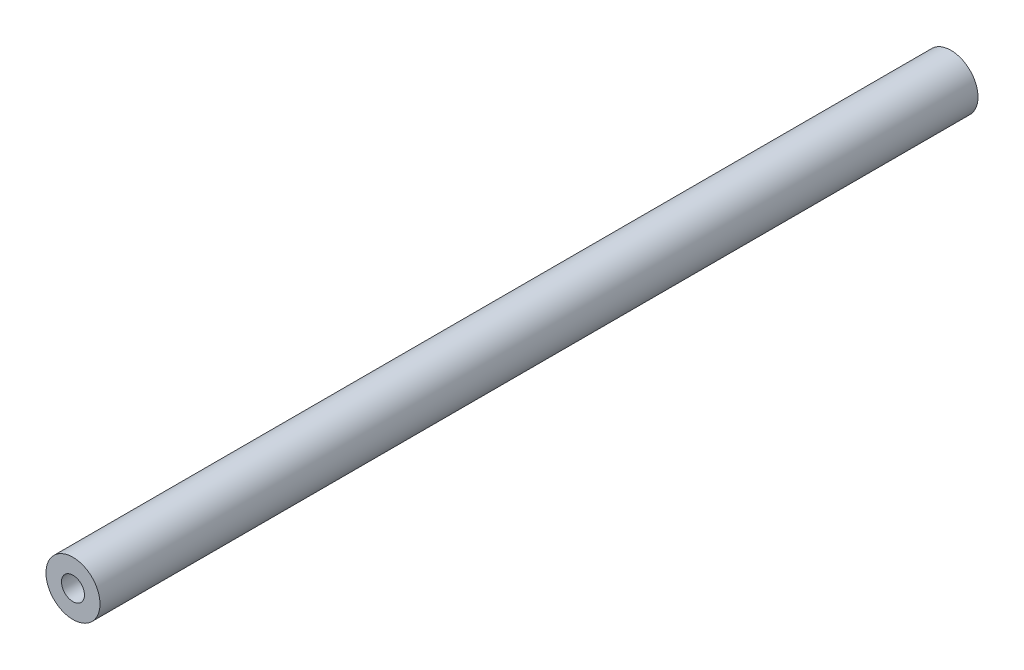
ISO-10303-21;
HEADER;
FILE_DESCRIPTION(('STEP AP214'),'2;1');
FILE_NAME('part.step','',(''),(''),'','','');
FILE_SCHEMA(('AUTOMOTIVE_DESIGN { 1 0 10303 214 1 1 1 1 }'));
ENDSEC;
DATA;
#1=APPLICATION_CONTEXT('core data for automotive mechanical design processes');
#2=APPLICATION_PROTOCOL_DEFINITION('international standard','automotive_design',2000,#1);
#3=PRODUCT_CONTEXT('',#1,'mechanical');
#4=PRODUCT('Part','Part','',(#3));
#5=PRODUCT_RELATED_PRODUCT_CATEGORY('part','',(#4));
#6=PRODUCT_DEFINITION_FORMATION('','',#4);
#7=PRODUCT_DEFINITION_CONTEXT('part definition',#1,'design');
#8=PRODUCT_DEFINITION('design','',#6,#7);
#9=PRODUCT_DEFINITION_SHAPE('','',#8);
#10=(LENGTH_UNIT() NAMED_UNIT(*) SI_UNIT(.MILLI.,.METRE.));
#11=(NAMED_UNIT(*) PLANE_ANGLE_UNIT() SI_UNIT($,.RADIAN.));
#12=(NAMED_UNIT(*) SI_UNIT($,.STERADIAN.) SOLID_ANGLE_UNIT());
#13=UNCERTAINTY_MEASURE_WITH_UNIT(LENGTH_MEASURE(1.E-05),#10,'distance_accuracy_value','');
#14=(GEOMETRIC_REPRESENTATION_CONTEXT(3) GLOBAL_UNCERTAINTY_ASSIGNED_CONTEXT((#13)) GLOBAL_UNIT_ASSIGNED_CONTEXT((#10,
#11,#12)) REPRESENTATION_CONTEXT('',''));
#15=CARTESIAN_POINT('',(0.,0.,0.));
#16=DIRECTION('',(0.,0.,1.));
#17=DIRECTION('',(1.,0.,0.));
#18=AXIS2_PLACEMENT_3D('',#15,#16,#17);
#19=CARTESIAN_POINT('',(0.,0.,260.));
#20=DIRECTION('',(0.,0.,-1.));
#21=DIRECTION('',(-1.,0.,0.));
#22=AXIS2_PLACEMENT_3D('',#19,#20,#21);
#23=CYLINDRICAL_SURFACE('',#22,8.);
#24=CARTESIAN_POINT('',(0.,0.,260.));
#25=DIRECTION('',(0.,0.,1.));
#26=DIRECTION('',(1.,0.,0.));
#27=AXIS2_PLACEMENT_3D('',#24,#25,#26);
#28=CIRCLE('',#27,8.);
#29=CARTESIAN_POINT('',(8.,0.,260.));
#30=VERTEX_POINT('',#29);
#31=EDGE_CURVE('E11',#30,#30,#28,.T.);
#32=ORIENTED_EDGE('',*,*,#31,.F.);
#33=EDGE_LOOP('',(#32));
#34=FACE_BOUND('',#33,.T.);
#35=CARTESIAN_POINT('',(0.,0.,0.));
#36=DIRECTION('',(0.,0.,1.));
#37=DIRECTION('',(1.,0.,0.));
#38=AXIS2_PLACEMENT_3D('',#35,#36,#37);
#39=CIRCLE('',#38,8.);
#40=CARTESIAN_POINT('',(8.,0.,0.));
#41=VERTEX_POINT('',#40);
#42=EDGE_CURVE('E40',#41,#41,#39,.T.);
#43=ORIENTED_EDGE('',*,*,#42,.T.);
#44=EDGE_LOOP('',(#43));
#45=FACE_BOUND('',#44,.T.);
#46=ADVANCED_FACE('F37',(#34,#45),#23,.T.);
#47=CARTESIAN_POINT('',(0.,0.,260.));
#48=DIRECTION('',(0.,0.,1.));
#49=DIRECTION('',(1.,0.,0.));
#50=AXIS2_PLACEMENT_3D('',#47,#48,#49);
#51=PLANE('',#50);
#52=CARTESIAN_POINT('',(0.,0.,260.));
#53=DIRECTION('',(0.,0.,1.));
#54=DIRECTION('',(1.,0.,0.));
#55=AXIS2_PLACEMENT_3D('',#52,#53,#54);
#56=CIRCLE('',#55,3.39999999999999);
#57=CARTESIAN_POINT('',(3.39999999999999,0.,260.));
#58=VERTEX_POINT('',#57);
#59=EDGE_CURVE('E60',#58,#58,#56,.T.);
#60=ORIENTED_EDGE('',*,*,#59,.F.);
#61=EDGE_LOOP('',(#60));
#62=FACE_BOUND('',#61,.T.);
#63=ORIENTED_EDGE('',*,*,#31,.T.);
#64=EDGE_LOOP('',(#63));
#65=FACE_BOUND('',#64,.T.);
#66=ADVANCED_FACE('F79',(#62,#65),#51,.T.);
#67=CARTESIAN_POINT('',(0.,0.,0.));
#68=DIRECTION('',(0.,0.,1.));
#69=DIRECTION('',(1.,0.,0.));
#70=AXIS2_PLACEMENT_3D('',#67,#68,#69);
#71=PLANE('',#70);
#72=CARTESIAN_POINT('',(0.,0.,0.));
#73=DIRECTION('',(0.,0.,-1.));
#74=DIRECTION('',(-1.,0.,0.));
#75=AXIS2_PLACEMENT_3D('',#72,#73,#74);
#76=CIRCLE('',#75,3.39999999999999);
#77=CARTESIAN_POINT('',(-3.39999999999999,0.,0.));
#78=VERTEX_POINT('',#77);
#79=EDGE_CURVE('E61',#78,#78,#76,.T.);
#80=ORIENTED_EDGE('',*,*,#79,.F.);
#81=EDGE_LOOP('',(#80));
#82=FACE_BOUND('',#81,.T.);
#83=ORIENTED_EDGE('',*,*,#42,.F.);
#84=EDGE_LOOP('',(#83));
#85=FACE_BOUND('',#84,.T.);
#86=ADVANCED_FACE('F76',(#82,#85),#71,.F.);
#87=CARTESIAN_POINT('',(0.,0.,233.75));
#88=DIRECTION('',(0.,0.,1.));
#89=DIRECTION('',(1.,0.,0.));
#90=AXIS2_PLACEMENT_3D('',#87,#88,#89);
#91=CONICAL_SURFACE('',#90,3.39999999999999,1.02974425867665);
#92=CARTESIAN_POINT('',(0.,0.,231.707073895306));
#93=VERTEX_POINT('',#92);
#94=VERTEX_LOOP('',#93);
#95=FACE_BOUND('',#94,.T.);
#96=CARTESIAN_POINT('',(0.,0.,233.75));
#97=DIRECTION('',(0.,0.,1.));
#98=DIRECTION('',(1.,0.,0.));
#99=AXIS2_PLACEMENT_3D('',#96,#97,#98);
#100=CIRCLE('',#99,3.39999999999999);
#101=CARTESIAN_POINT('',(3.39999999999999,0.,233.75));
#102=VERTEX_POINT('',#101);
#103=EDGE_CURVE('E64',#102,#102,#100,.T.);
#104=ORIENTED_EDGE('',*,*,#103,.T.);
#105=EDGE_LOOP('',(#104));
#106=FACE_BOUND('',#105,.T.);
#107=ADVANCED_FACE('F78',(#95,#106),#91,.F.);
#108=CARTESIAN_POINT('',(0.,0.,260.));
#109=DIRECTION('',(0.,0.,1.));
#110=DIRECTION('',(1.,0.,0.));
#111=AXIS2_PLACEMENT_3D('',#108,#109,#110);
#112=CYLINDRICAL_SURFACE('',#111,3.39999999999999);
#113=ORIENTED_EDGE('',*,*,#103,.F.);
#114=EDGE_LOOP('',(#113));
#115=FACE_BOUND('',#114,.T.);
#116=ORIENTED_EDGE('',*,*,#59,.T.);
#117=EDGE_LOOP('',(#116));
#118=FACE_BOUND('',#117,.T.);
#119=ADVANCED_FACE('F54',(#115,#118),#112,.F.);
#120=CARTESIAN_POINT('',(0.,0.,26.25));
#121=DIRECTION('',(0.,0.,-1.));
#122=DIRECTION('',(-1.,0.,0.));
#123=AXIS2_PLACEMENT_3D('',#120,#121,#122);
#124=CONICAL_SURFACE('',#123,3.39999999999999,1.02974425867665);
#125=CARTESIAN_POINT('',(0.,0.,28.2929261046937));
#126=VERTEX_POINT('',#125);
#127=VERTEX_LOOP('',#126);
#128=FACE_BOUND('',#127,.T.);
#129=CARTESIAN_POINT('',(0.,0.,26.25));
#130=DIRECTION('',(0.,0.,-1.));
#131=DIRECTION('',(-1.,0.,0.));
#132=AXIS2_PLACEMENT_3D('',#129,#130,#131);
#133=CIRCLE('',#132,3.39999999999999);
#134=CARTESIAN_POINT('',(-3.39999999999999,0.,26.25));
#135=VERTEX_POINT('',#134);
#136=EDGE_CURVE('E58',#135,#135,#133,.T.);
#137=ORIENTED_EDGE('',*,*,#136,.T.);
#138=EDGE_LOOP('',(#137));
#139=FACE_BOUND('',#138,.T.);
#140=ADVANCED_FACE('F50',(#128,#139),#124,.F.);
#141=CARTESIAN_POINT('',(0.,0.,0.));
#142=DIRECTION('',(0.,0.,-1.));
#143=DIRECTION('',(-1.,0.,0.));
#144=AXIS2_PLACEMENT_3D('',#141,#142,#143);
#145=CYLINDRICAL_SURFACE('',#144,3.39999999999999);
#146=ORIENTED_EDGE('',*,*,#136,.F.);
#147=EDGE_LOOP('',(#146));
#148=FACE_BOUND('',#147,.T.);
#149=ORIENTED_EDGE('',*,*,#79,.T.);
#150=EDGE_LOOP('',(#149));
#151=FACE_BOUND('',#150,.T.);
#152=ADVANCED_FACE('F53',(#148,#151),#145,.F.);
#153=CLOSED_SHELL('',(#46,#66,#86,#107,#119,#140,#152));
#154=MANIFOLD_SOLID_BREP('B2',#153);
#155=ADVANCED_BREP_SHAPE_REPRESENTATION('',(#18,#154),#14);
#156=SHAPE_DEFINITION_REPRESENTATION(#9,#155);
ENDSEC;
END-ISO-10303-21;
